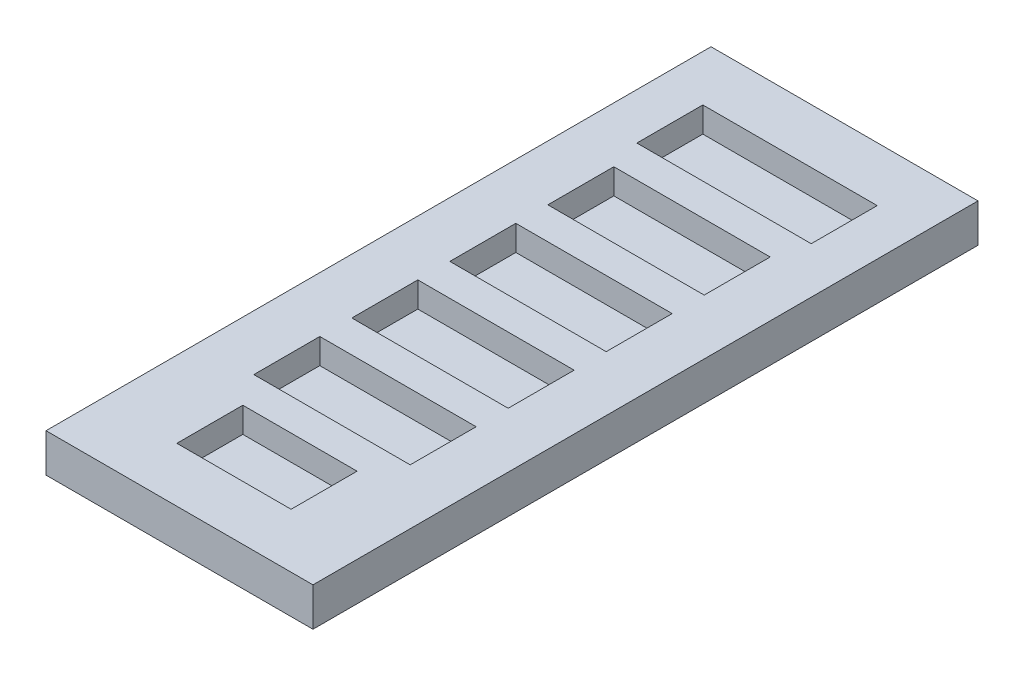
ISO-10303-21;
HEADER;
FILE_DESCRIPTION(('STEP AP214'),'2;1');
FILE_NAME('part.step','',(''),(''),'','','');
FILE_SCHEMA(('AUTOMOTIVE_DESIGN { 1 0 10303 214 1 1 1 1 }'));
ENDSEC;
DATA;
#1=APPLICATION_CONTEXT('core data for automotive mechanical design processes');
#2=APPLICATION_PROTOCOL_DEFINITION('international standard','automotive_design',2000,#1);
#3=PRODUCT_CONTEXT('',#1,'mechanical');
#4=PRODUCT('Part','Part','',(#3));
#5=PRODUCT_RELATED_PRODUCT_CATEGORY('part','',(#4));
#6=PRODUCT_DEFINITION_FORMATION('','',#4);
#7=PRODUCT_DEFINITION_CONTEXT('part definition',#1,'design');
#8=PRODUCT_DEFINITION('design','',#6,#7);
#9=PRODUCT_DEFINITION_SHAPE('','',#8);
#10=(LENGTH_UNIT() NAMED_UNIT(*) SI_UNIT(.MILLI.,.METRE.));
#11=(NAMED_UNIT(*) PLANE_ANGLE_UNIT() SI_UNIT($,.RADIAN.));
#12=(NAMED_UNIT(*) SI_UNIT($,.STERADIAN.) SOLID_ANGLE_UNIT());
#13=UNCERTAINTY_MEASURE_WITH_UNIT(LENGTH_MEASURE(1.E-05),#10,'distance_accuracy_value','');
#14=(GEOMETRIC_REPRESENTATION_CONTEXT(3) GLOBAL_UNCERTAINTY_ASSIGNED_CONTEXT((#13)) GLOBAL_UNIT_ASSIGNED_CONTEXT((#10,
#11,#12)) REPRESENTATION_CONTEXT('',''));
#15=CARTESIAN_POINT('',(0.,0.,0.));
#16=DIRECTION('',(0.,0.,1.));
#17=DIRECTION('',(1.,0.,0.));
#18=AXIS2_PLACEMENT_3D('',#15,#16,#17);
#19=CARTESIAN_POINT('',(444.,-64.,0.));
#20=DIRECTION('',(1.,0.,0.));
#21=DIRECTION('',(0.,0.,-1.));
#22=AXIS2_PLACEMENT_3D('',#19,#20,#21);
#23=PLANE('',#22);
#24=DIRECTION('',(0.,0.,-1.));
#25=VECTOR('',#24,1.);
#26=CARTESIAN_POINT('',(444.,0.,0.));
#27=LINE('',#26,#25);
#28=CARTESIAN_POINT('',(444.,0.,0.));
#29=VERTEX_POINT('',#28);
#30=CARTESIAN_POINT('',(444.,0.,-1106.));
#31=VERTEX_POINT('',#30);
#32=EDGE_CURVE('E255',#29,#31,#27,.T.);
#33=ORIENTED_EDGE('',*,*,#32,.F.);
#34=DIRECTION('',(0.,1.,0.));
#35=VECTOR('',#34,1.);
#36=CARTESIAN_POINT('',(444.,-64.,0.));
#37=LINE('',#36,#35);
#38=CARTESIAN_POINT('',(444.,-64.,0.));
#39=VERTEX_POINT('',#38);
#40=EDGE_CURVE('E11',#39,#29,#37,.T.);
#41=ORIENTED_EDGE('',*,*,#40,.F.);
#42=DIRECTION('',(0.,0.,-1.));
#43=VECTOR('',#42,1.);
#44=CARTESIAN_POINT('',(444.,-64.,0.));
#45=LINE('',#44,#43);
#46=CARTESIAN_POINT('',(444.,-64.,-1106.));
#47=VERTEX_POINT('',#46);
#48=EDGE_CURVE('E406',#39,#47,#45,.T.);
#49=ORIENTED_EDGE('',*,*,#48,.T.);
#50=DIRECTION('',(0.,1.,0.));
#51=VECTOR('',#50,1.);
#52=CARTESIAN_POINT('',(444.,-64.,-1106.));
#53=LINE('',#52,#51);
#54=EDGE_CURVE('E38',#47,#31,#53,.T.);
#55=ORIENTED_EDGE('',*,*,#54,.T.);
#56=EDGE_LOOP('',(#33,#41,#49,#55));
#57=FACE_BOUND('',#56,.T.);
#58=ADVANCED_FACE('F35',(#57),#23,.T.);
#59=CARTESIAN_POINT('',(0.,-64.,0.));
#60=DIRECTION('',(0.,0.,1.));
#61=DIRECTION('',(1.,0.,0.));
#62=AXIS2_PLACEMENT_3D('',#59,#60,#61);
#63=PLANE('',#62);
#64=DIRECTION('',(1.,0.,0.));
#65=VECTOR('',#64,1.);
#66=CARTESIAN_POINT('',(0.,0.,0.));
#67=LINE('',#66,#65);
#68=CARTESIAN_POINT('',(0.,0.,0.));
#69=VERTEX_POINT('',#68);
#70=EDGE_CURVE('E410',#69,#29,#67,.T.);
#71=ORIENTED_EDGE('',*,*,#70,.F.);
#72=DIRECTION('',(0.,1.,0.));
#73=VECTOR('',#72,1.);
#74=CARTESIAN_POINT('',(0.,-64.,0.));
#75=LINE('',#74,#73);
#76=CARTESIAN_POINT('',(0.,-64.,0.));
#77=VERTEX_POINT('',#76);
#78=EDGE_CURVE('E43',#77,#69,#75,.T.);
#79=ORIENTED_EDGE('',*,*,#78,.F.);
#80=DIRECTION('',(1.,0.,0.));
#81=VECTOR('',#80,1.);
#82=CARTESIAN_POINT('',(0.,-64.,0.));
#83=LINE('',#82,#81);
#84=EDGE_CURVE('E414',#77,#39,#83,.T.);
#85=ORIENTED_EDGE('',*,*,#84,.T.);
#86=ORIENTED_EDGE('',*,*,#40,.T.);
#87=EDGE_LOOP('',(#71,#79,#85,#86));
#88=FACE_BOUND('',#87,.T.);
#89=ADVANCED_FACE('F442',(#88),#63,.T.);
#90=CARTESIAN_POINT('',(0.,-64.,0.));
#91=DIRECTION('',(1.,0.,0.));
#92=DIRECTION('',(0.,0.,-1.));
#93=AXIS2_PLACEMENT_3D('',#90,#91,#92);
#94=PLANE('',#93);
#95=DIRECTION('',(0.,0.,-1.));
#96=VECTOR('',#95,1.);
#97=CARTESIAN_POINT('',(0.,0.,0.));
#98=LINE('',#97,#96);
#99=CARTESIAN_POINT('',(0.,0.,-1106.));
#100=VERTEX_POINT('',#99);
#101=EDGE_CURVE('E422',#69,#100,#98,.T.);
#102=ORIENTED_EDGE('',*,*,#101,.T.);
#103=DIRECTION('',(0.,1.,0.));
#104=VECTOR('',#103,1.);
#105=CARTESIAN_POINT('',(0.,-64.,-1106.));
#106=LINE('',#105,#104);
#107=CARTESIAN_POINT('',(0.,-64.,-1106.));
#108=VERTEX_POINT('',#107);
#109=EDGE_CURVE('E426',#108,#100,#106,.T.);
#110=ORIENTED_EDGE('',*,*,#109,.F.);
#111=DIRECTION('',(0.,0.,-1.));
#112=VECTOR('',#111,1.);
#113=CARTESIAN_POINT('',(0.,-64.,0.));
#114=LINE('',#113,#112);
#115=EDGE_CURVE('E412',#77,#108,#114,.T.);
#116=ORIENTED_EDGE('',*,*,#115,.F.);
#117=ORIENTED_EDGE('',*,*,#78,.T.);
#118=EDGE_LOOP('',(#102,#110,#116,#117));
#119=FACE_BOUND('',#118,.T.);
#120=ADVANCED_FACE('F448',(#119),#94,.F.);
#121=CARTESIAN_POINT('',(0.,-64.,-1106.));
#122=DIRECTION('',(0.,0.,1.));
#123=DIRECTION('',(1.,0.,0.));
#124=AXIS2_PLACEMENT_3D('',#121,#122,#123);
#125=PLANE('',#124);
#126=DIRECTION('',(1.,0.,0.));
#127=VECTOR('',#126,1.);
#128=CARTESIAN_POINT('',(0.,0.,-1106.));
#129=LINE('',#128,#127);
#130=EDGE_CURVE('E419',#100,#31,#129,.T.);
#131=ORIENTED_EDGE('',*,*,#130,.T.);
#132=ORIENTED_EDGE('',*,*,#54,.F.);
#133=DIRECTION('',(1.,0.,0.));
#134=VECTOR('',#133,1.);
#135=CARTESIAN_POINT('',(0.,-64.,-1106.));
#136=LINE('',#135,#134);
#137=EDGE_CURVE('E409',#108,#47,#136,.T.);
#138=ORIENTED_EDGE('',*,*,#137,.F.);
#139=ORIENTED_EDGE('',*,*,#109,.T.);
#140=EDGE_LOOP('',(#131,#132,#138,#139));
#141=FACE_BOUND('',#140,.T.);
#142=ADVANCED_FACE('F436',(#141),#125,.F.);
#143=CARTESIAN_POINT('',(0.,-64.,0.));
#144=DIRECTION('',(0.,-1.,0.));
#145=DIRECTION('',(0.,0.,-1.));
#146=AXIS2_PLACEMENT_3D('',#143,#144,#145);
#147=PLANE('',#146);
#148=ORIENTED_EDGE('',*,*,#48,.F.);
#149=ORIENTED_EDGE('',*,*,#84,.F.);
#150=ORIENTED_EDGE('',*,*,#115,.T.);
#151=ORIENTED_EDGE('',*,*,#137,.T.);
#152=EDGE_LOOP('',(#148,#149,#150,#151));
#153=FACE_BOUND('',#152,.T.);
#154=ADVANCED_FACE('F446',(#153),#147,.T.);
#155=CARTESIAN_POINT('',(0.,0.,0.));
#156=DIRECTION('',(0.,-1.,0.));
#157=DIRECTION('',(0.,0.,-1.));
#158=AXIS2_PLACEMENT_3D('',#155,#156,#157);
#159=PLANE('',#158);
#160=DIRECTION('',(0.,0.,-1.));
#161=VECTOR('',#160,1.);
#162=CARTESIAN_POINT('',(317.,0.,-200.363466897381));
#163=LINE('',#162,#161);
#164=CARTESIAN_POINT('',(317.,0.,-90.6365331026193));
#165=VERTEX_POINT('',#164);
#166=CARTESIAN_POINT('',(317.,0.,-200.363466897381));
#167=VERTEX_POINT('',#166);
#168=EDGE_CURVE('E245',#165,#167,#163,.T.);
#169=ORIENTED_EDGE('',*,*,#168,.F.);
#170=DIRECTION('',(1.,0.,0.));
#171=VECTOR('',#170,1.);
#172=CARTESIAN_POINT('',(127.,0.,-90.6365331026193));
#173=LINE('',#172,#171);
#174=CARTESIAN_POINT('',(127.,0.,-90.6365331026193));
#175=VERTEX_POINT('',#174);
#176=EDGE_CURVE('E224',#175,#165,#173,.T.);
#177=ORIENTED_EDGE('',*,*,#176,.F.);
#178=DIRECTION('',(0.,0.,1.));
#179=VECTOR('',#178,1.);
#180=CARTESIAN_POINT('',(127.,0.,-200.363466897381));
#181=LINE('',#180,#179);
#182=CARTESIAN_POINT('',(127.,0.,-200.363466897381));
#183=VERTEX_POINT('',#182);
#184=EDGE_CURVE('E240',#183,#175,#181,.T.);
#185=ORIENTED_EDGE('',*,*,#184,.F.);
#186=DIRECTION('',(-1.,0.,0.));
#187=VECTOR('',#186,1.);
#188=CARTESIAN_POINT('',(222.,0.,-200.363466897381));
#189=LINE('',#188,#187);
#190=EDGE_CURVE('E247',#167,#183,#189,.T.);
#191=ORIENTED_EDGE('',*,*,#190,.F.);
#192=EDGE_LOOP('',(#169,#177,#185,#191));
#193=FACE_BOUND('',#192,.T.);
#194=DIRECTION('',(-1.,0.,0.));
#195=VECTOR('',#194,1.);
#196=CARTESIAN_POINT('',(222.,0.,-1015.36346689738));
#197=LINE('',#196,#195);
#198=CARTESIAN_POINT('',(367.,0.,-1015.36346689738));
#199=VERTEX_POINT('',#198);
#200=CARTESIAN_POINT('',(76.9999999999998,0.,-1015.36346689738));
#201=VERTEX_POINT('',#200);
#202=EDGE_CURVE('E270',#199,#201,#197,.T.);
#203=ORIENTED_EDGE('',*,*,#202,.F.);
#204=DIRECTION('',(0.,0.,-1.));
#205=VECTOR('',#204,1.);
#206=CARTESIAN_POINT('',(367.,0.,-1015.36346689738));
#207=LINE('',#206,#205);
#208=CARTESIAN_POINT('',(367.,0.,-905.636533102621));
#209=VERTEX_POINT('',#208);
#210=EDGE_CURVE('E59',#209,#199,#207,.T.);
#211=ORIENTED_EDGE('',*,*,#210,.F.);
#212=DIRECTION('',(1.,0.,0.));
#213=VECTOR('',#212,1.);
#214=CARTESIAN_POINT('',(367.,0.,-905.636533102621));
#215=LINE('',#214,#213);
#216=CARTESIAN_POINT('',(76.9999999999998,0.,-905.63653310262));
#217=VERTEX_POINT('',#216);
#218=EDGE_CURVE('E277',#217,#209,#215,.T.);
#219=ORIENTED_EDGE('',*,*,#218,.F.);
#220=DIRECTION('',(0.,0.,1.));
#221=VECTOR('',#220,1.);
#222=CARTESIAN_POINT('',(76.9999999999998,0.,-1015.36346689738));
#223=LINE('',#222,#221);
#224=EDGE_CURVE('E273',#201,#217,#223,.T.);
#225=ORIENTED_EDGE('',*,*,#224,.F.);
#226=EDGE_LOOP('',(#203,#211,#219,#225));
#227=FACE_BOUND('',#226,.T.);
#228=DIRECTION('',(-1.,0.,0.));
#229=VECTOR('',#228,1.);
#230=CARTESIAN_POINT('',(222.,0.,-852.363466897382));
#231=LINE('',#230,#229);
#232=CARTESIAN_POINT('',(352.,0.,-852.363466897382));
#233=VERTEX_POINT('',#232);
#234=CARTESIAN_POINT('',(91.9999999999998,0.,-852.363466897382));
#235=VERTEX_POINT('',#234);
#236=EDGE_CURVE('E299',#233,#235,#231,.T.);
#237=ORIENTED_EDGE('',*,*,#236,.F.);
#238=DIRECTION('',(0.,0.,-1.));
#239=VECTOR('',#238,1.);
#240=CARTESIAN_POINT('',(352.,0.,-852.363466897382));
#241=LINE('',#240,#239);
#242=CARTESIAN_POINT('',(352.,0.,-742.63653310262));
#243=VERTEX_POINT('',#242);
#244=EDGE_CURVE('E290',#243,#233,#241,.T.);
#245=ORIENTED_EDGE('',*,*,#244,.F.);
#246=DIRECTION('',(1.,0.,0.));
#247=VECTOR('',#246,1.);
#248=CARTESIAN_POINT('',(352.,0.,-742.63653310262));
#249=LINE('',#248,#247);
#250=CARTESIAN_POINT('',(91.9999999999998,0.,-742.63653310262));
#251=VERTEX_POINT('',#250);
#252=EDGE_CURVE('E306',#251,#243,#249,.T.);
#253=ORIENTED_EDGE('',*,*,#252,.F.);
#254=DIRECTION('',(0.,0.,1.));
#255=VECTOR('',#254,1.);
#256=CARTESIAN_POINT('',(91.9999999999998,0.,-852.363466897382));
#257=LINE('',#256,#255);
#258=EDGE_CURVE('E302',#235,#251,#257,.T.);
#259=ORIENTED_EDGE('',*,*,#258,.F.);
#260=EDGE_LOOP('',(#237,#245,#253,#259));
#261=FACE_BOUND('',#260,.T.);
#262=DIRECTION('',(-1.,0.,0.));
#263=VECTOR('',#262,1.);
#264=CARTESIAN_POINT('',(222.,0.,-689.363466897382));
#265=LINE('',#264,#263);
#266=CARTESIAN_POINT('',(352.,0.,-689.363466897382));
#267=VERTEX_POINT('',#266);
#268=CARTESIAN_POINT('',(91.9999999999997,0.,-689.363466897382));
#269=VERTEX_POINT('',#268);
#270=EDGE_CURVE('E329',#267,#269,#265,.T.);
#271=ORIENTED_EDGE('',*,*,#270,.F.);
#272=DIRECTION('',(0.,0.,-1.));
#273=VECTOR('',#272,1.);
#274=CARTESIAN_POINT('',(352.,0.,-689.363466897382));
#275=LINE('',#274,#273);
#276=CARTESIAN_POINT('',(352.,0.,-579.63653310262));
#277=VERTEX_POINT('',#276);
#278=EDGE_CURVE('E320',#277,#267,#275,.T.);
#279=ORIENTED_EDGE('',*,*,#278,.F.);
#280=DIRECTION('',(1.,0.,0.));
#281=VECTOR('',#280,1.);
#282=CARTESIAN_POINT('',(352.,0.,-579.63653310262));
#283=LINE('',#282,#281);
#284=CARTESIAN_POINT('',(91.9999999999998,0.,-579.63653310262));
#285=VERTEX_POINT('',#284);
#286=EDGE_CURVE('E336',#285,#277,#283,.T.);
#287=ORIENTED_EDGE('',*,*,#286,.F.);
#288=DIRECTION('',(0.,0.,1.));
#289=VECTOR('',#288,1.);
#290=CARTESIAN_POINT('',(91.9999999999997,0.,-689.363466897382));
#291=LINE('',#290,#289);
#292=EDGE_CURVE('E332',#269,#285,#291,.T.);
#293=ORIENTED_EDGE('',*,*,#292,.F.);
#294=EDGE_LOOP('',(#271,#279,#287,#293));
#295=FACE_BOUND('',#294,.T.);
#296=DIRECTION('',(-1.,0.,0.));
#297=VECTOR('',#296,1.);
#298=CARTESIAN_POINT('',(222.,0.,-526.363466897381));
#299=LINE('',#298,#297);
#300=CARTESIAN_POINT('',(352.,0.,-526.363466897381));
#301=VERTEX_POINT('',#300);
#302=CARTESIAN_POINT('',(91.9999999999997,0.,-526.363466897381));
#303=VERTEX_POINT('',#302);
#304=EDGE_CURVE('E359',#301,#303,#299,.T.);
#305=ORIENTED_EDGE('',*,*,#304,.F.);
#306=DIRECTION('',(0.,0.,-1.));
#307=VECTOR('',#306,1.);
#308=CARTESIAN_POINT('',(352.,0.,-526.363466897381));
#309=LINE('',#308,#307);
#310=CARTESIAN_POINT('',(352.,0.,-416.63653310262));
#311=VERTEX_POINT('',#310);
#312=EDGE_CURVE('E350',#311,#301,#309,.T.);
#313=ORIENTED_EDGE('',*,*,#312,.F.);
#314=DIRECTION('',(1.,0.,0.));
#315=VECTOR('',#314,1.);
#316=CARTESIAN_POINT('',(352.,0.,-416.63653310262));
#317=LINE('',#316,#315);
#318=CARTESIAN_POINT('',(91.9999999999997,0.,-416.63653310262));
#319=VERTEX_POINT('',#318);
#320=EDGE_CURVE('E366',#319,#311,#317,.T.);
#321=ORIENTED_EDGE('',*,*,#320,.F.);
#322=DIRECTION('',(0.,0.,1.));
#323=VECTOR('',#322,1.);
#324=CARTESIAN_POINT('',(91.9999999999997,0.,-526.363466897381));
#325=LINE('',#324,#323);
#326=EDGE_CURVE('E362',#303,#319,#325,.T.);
#327=ORIENTED_EDGE('',*,*,#326,.F.);
#328=EDGE_LOOP('',(#305,#313,#321,#327));
#329=FACE_BOUND('',#328,.T.);
#330=DIRECTION('',(-1.,0.,0.));
#331=VECTOR('',#330,1.);
#332=CARTESIAN_POINT('',(222.,0.,-363.363466897381));
#333=LINE('',#332,#331);
#334=CARTESIAN_POINT('',(352.,0.,-363.363466897381));
#335=VERTEX_POINT('',#334);
#336=CARTESIAN_POINT('',(91.9999999999997,0.,-363.363466897381));
#337=VERTEX_POINT('',#336);
#338=EDGE_CURVE('E389',#335,#337,#333,.T.);
#339=ORIENTED_EDGE('',*,*,#338,.F.);
#340=DIRECTION('',(0.,0.,-1.));
#341=VECTOR('',#340,1.);
#342=CARTESIAN_POINT('',(352.,0.,-363.363466897381));
#343=LINE('',#342,#341);
#344=CARTESIAN_POINT('',(352.,0.,-253.636533102619));
#345=VERTEX_POINT('',#344);
#346=EDGE_CURVE('E380',#345,#335,#343,.T.);
#347=ORIENTED_EDGE('',*,*,#346,.F.);
#348=DIRECTION('',(1.,0.,0.));
#349=VECTOR('',#348,1.);
#350=CARTESIAN_POINT('',(352.,0.,-253.636533102619));
#351=LINE('',#350,#349);
#352=CARTESIAN_POINT('',(91.9999999999997,0.,-253.636533102619));
#353=VERTEX_POINT('',#352);
#354=EDGE_CURVE('E395',#353,#345,#351,.T.);
#355=ORIENTED_EDGE('',*,*,#354,.F.);
#356=DIRECTION('',(0.,0.,1.));
#357=VECTOR('',#356,1.);
#358=CARTESIAN_POINT('',(91.9999999999997,0.,-363.363466897381));
#359=LINE('',#358,#357);
#360=EDGE_CURVE('E392',#337,#353,#359,.T.);
#361=ORIENTED_EDGE('',*,*,#360,.F.);
#362=EDGE_LOOP('',(#339,#347,#355,#361));
#363=FACE_BOUND('',#362,.T.);
#364=ORIENTED_EDGE('',*,*,#32,.T.);
#365=ORIENTED_EDGE('',*,*,#130,.F.);
#366=ORIENTED_EDGE('',*,*,#101,.F.);
#367=ORIENTED_EDGE('',*,*,#70,.T.);
#368=EDGE_LOOP('',(#364,#365,#366,#367));
#369=FACE_BOUND('',#368,.T.);
#370=ADVANCED_FACE('F439',(#193,#227,#261,#295,#329,#363,#369),#159,.F.);
#371=CARTESIAN_POINT('',(352.,-42.,-363.363466897381));
#372=DIRECTION('',(1.,0.,0.));
#373=DIRECTION('',(0.,0.,-1.));
#374=AXIS2_PLACEMENT_3D('',#371,#372,#373);
#375=PLANE('',#374);
#376=ORIENTED_EDGE('',*,*,#346,.T.);
#377=DIRECTION('',(0.,1.,0.));
#378=VECTOR('',#377,1.);
#379=CARTESIAN_POINT('',(352.,-42.,-363.363466897381));
#380=LINE('',#379,#378);
#381=CARTESIAN_POINT('',(352.,-42.,-363.363466897381));
#382=VERTEX_POINT('',#381);
#383=EDGE_CURVE('E363',#382,#335,#380,.T.);
#384=ORIENTED_EDGE('',*,*,#383,.F.);
#385=DIRECTION('',(0.,0.,-1.));
#386=VECTOR('',#385,1.);
#387=CARTESIAN_POINT('',(352.,-42.,-363.363466897381));
#388=LINE('',#387,#386);
#389=CARTESIAN_POINT('',(352.,-42.,-253.636533102619));
#390=VERTEX_POINT('',#389);
#391=EDGE_CURVE('E385',#390,#382,#388,.T.);
#392=ORIENTED_EDGE('',*,*,#391,.F.);
#393=DIRECTION('',(0.,1.,0.));
#394=VECTOR('',#393,1.);
#395=CARTESIAN_POINT('',(352.,-42.,-253.636533102619));
#396=LINE('',#395,#394);
#397=EDGE_CURVE('E401',#390,#345,#396,.T.);
#398=ORIENTED_EDGE('',*,*,#397,.T.);
#399=EDGE_LOOP('',(#376,#384,#392,#398));
#400=FACE_BOUND('',#399,.T.);
#401=ADVANCED_FACE('F490',(#400),#375,.F.);
#402=CARTESIAN_POINT('',(352.,-42.,-253.636533102619));
#403=DIRECTION('',(0.,0.,1.));
#404=DIRECTION('',(1.,0.,0.));
#405=AXIS2_PLACEMENT_3D('',#402,#403,#404);
#406=PLANE('',#405);
#407=ORIENTED_EDGE('',*,*,#354,.T.);
#408=ORIENTED_EDGE('',*,*,#397,.F.);
#409=DIRECTION('',(1.,0.,0.));
#410=VECTOR('',#409,1.);
#411=CARTESIAN_POINT('',(91.9999999999997,-42.,-253.636533102619));
#412=LINE('',#411,#410);
#413=CARTESIAN_POINT('',(91.9999999999997,-42.,-253.636533102619));
#414=VERTEX_POINT('',#413);
#415=EDGE_CURVE('E383',#414,#390,#412,.T.);
#416=ORIENTED_EDGE('',*,*,#415,.F.);
#417=DIRECTION('',(0.,1.,0.));
#418=VECTOR('',#417,1.);
#419=CARTESIAN_POINT('',(91.9999999999997,-42.,-253.636533102619));
#420=LINE('',#419,#418);
#421=EDGE_CURVE('E403',#414,#353,#420,.T.);
#422=ORIENTED_EDGE('',*,*,#421,.T.);
#423=EDGE_LOOP('',(#407,#408,#416,#422));
#424=FACE_BOUND('',#423,.T.);
#425=ADVANCED_FACE('F500',(#424),#406,.F.);
#426=CARTESIAN_POINT('',(91.9999999999997,-42.,-363.363466897381));
#427=DIRECTION('',(-1.,0.,0.));
#428=DIRECTION('',(0.,0.,1.));
#429=AXIS2_PLACEMENT_3D('',#426,#427,#428);
#430=PLANE('',#429);
#431=ORIENTED_EDGE('',*,*,#360,.T.);
#432=ORIENTED_EDGE('',*,*,#421,.F.);
#433=DIRECTION('',(0.,0.,1.));
#434=VECTOR('',#433,1.);
#435=CARTESIAN_POINT('',(91.9999999999997,-42.,-363.363466897381));
#436=LINE('',#435,#434);
#437=CARTESIAN_POINT('',(91.9999999999997,-42.,-363.363466897381));
#438=VERTEX_POINT('',#437);
#439=EDGE_CURVE('E379',#438,#414,#436,.T.);
#440=ORIENTED_EDGE('',*,*,#439,.F.);
#441=DIRECTION('',(0.,1.,0.));
#442=VECTOR('',#441,1.);
#443=CARTESIAN_POINT('',(91.9999999999997,-42.,-363.363466897381));
#444=LINE('',#443,#442);
#445=EDGE_CURVE('E388',#438,#337,#444,.T.);
#446=ORIENTED_EDGE('',*,*,#445,.T.);
#447=EDGE_LOOP('',(#431,#432,#440,#446));
#448=FACE_BOUND('',#447,.T.);
#449=ADVANCED_FACE('F511',(#448),#430,.F.);
#450=CARTESIAN_POINT('',(222.,-42.,-363.363466897381));
#451=DIRECTION('',(0.,0.,-1.));
#452=DIRECTION('',(-1.,0.,0.));
#453=AXIS2_PLACEMENT_3D('',#450,#451,#452);
#454=PLANE('',#453);
#455=ORIENTED_EDGE('',*,*,#338,.T.);
#456=ORIENTED_EDGE('',*,*,#445,.F.);
#457=DIRECTION('',(-1.,0.,0.));
#458=VECTOR('',#457,1.);
#459=CARTESIAN_POINT('',(222.,-42.,-363.363466897381));
#460=LINE('',#459,#458);
#461=EDGE_CURVE('E377',#382,#438,#460,.T.);
#462=ORIENTED_EDGE('',*,*,#461,.F.);
#463=ORIENTED_EDGE('',*,*,#383,.T.);
#464=EDGE_LOOP('',(#455,#456,#462,#463));
#465=FACE_BOUND('',#464,.T.);
#466=ADVANCED_FACE('F521',(#465),#454,.F.);
#467=CARTESIAN_POINT('',(0.,-42.,0.));
#468=DIRECTION('',(0.,-1.,0.));
#469=DIRECTION('',(0.,0.,-1.));
#470=AXIS2_PLACEMENT_3D('',#467,#468,#469);
#471=PLANE('',#470);
#472=ORIENTED_EDGE('',*,*,#461,.T.);
#473=ORIENTED_EDGE('',*,*,#439,.T.);
#474=ORIENTED_EDGE('',*,*,#415,.T.);
#475=ORIENTED_EDGE('',*,*,#391,.T.);
#476=EDGE_LOOP('',(#472,#473,#474,#475));
#477=FACE_BOUND('',#476,.T.);
#478=ADVANCED_FACE('F532',(#477),#471,.F.);
#479=CARTESIAN_POINT('',(352.,-42.,-526.363466897381));
#480=DIRECTION('',(1.,0.,0.));
#481=DIRECTION('',(0.,0.,-1.));
#482=AXIS2_PLACEMENT_3D('',#479,#480,#481);
#483=PLANE('',#482);
#484=ORIENTED_EDGE('',*,*,#312,.T.);
#485=DIRECTION('',(0.,1.,0.));
#486=VECTOR('',#485,1.);
#487=CARTESIAN_POINT('',(352.,-42.,-526.363466897381));
#488=LINE('',#487,#486);
#489=CARTESIAN_POINT('',(352.,-42.,-526.363466897381));
#490=VERTEX_POINT('',#489);
#491=EDGE_CURVE('E333',#490,#301,#488,.T.);
#492=ORIENTED_EDGE('',*,*,#491,.F.);
#493=DIRECTION('',(0.,0.,-1.));
#494=VECTOR('',#493,1.);
#495=CARTESIAN_POINT('',(352.,-42.,-526.363466897381));
#496=LINE('',#495,#494);
#497=CARTESIAN_POINT('',(352.,-42.,-416.63653310262));
#498=VERTEX_POINT('',#497);
#499=EDGE_CURVE('E355',#498,#490,#496,.T.);
#500=ORIENTED_EDGE('',*,*,#499,.F.);
#501=DIRECTION('',(0.,1.,0.));
#502=VECTOR('',#501,1.);
#503=CARTESIAN_POINT('',(352.,-42.,-416.63653310262));
#504=LINE('',#503,#502);
#505=EDGE_CURVE('E372',#498,#311,#504,.T.);
#506=ORIENTED_EDGE('',*,*,#505,.T.);
#507=EDGE_LOOP('',(#484,#492,#500,#506));
#508=FACE_BOUND('',#507,.T.);
#509=ADVANCED_FACE('F542',(#508),#483,.F.);
#510=CARTESIAN_POINT('',(352.,-42.,-416.63653310262));
#511=DIRECTION('',(0.,0.,1.));
#512=DIRECTION('',(1.,0.,0.));
#513=AXIS2_PLACEMENT_3D('',#510,#511,#512);
#514=PLANE('',#513);
#515=ORIENTED_EDGE('',*,*,#320,.T.);
#516=ORIENTED_EDGE('',*,*,#505,.F.);
#517=DIRECTION('',(1.,0.,0.));
#518=VECTOR('',#517,1.);
#519=CARTESIAN_POINT('',(91.9999999999997,-42.,-416.63653310262));
#520=LINE('',#519,#518);
#521=CARTESIAN_POINT('',(91.9999999999997,-42.,-416.63653310262));
#522=VERTEX_POINT('',#521);
#523=EDGE_CURVE('E353',#522,#498,#520,.T.);
#524=ORIENTED_EDGE('',*,*,#523,.F.);
#525=DIRECTION('',(0.,1.,0.));
#526=VECTOR('',#525,1.);
#527=CARTESIAN_POINT('',(91.9999999999997,-42.,-416.63653310262));
#528=LINE('',#527,#526);
#529=EDGE_CURVE('E374',#522,#319,#528,.T.);
#530=ORIENTED_EDGE('',*,*,#529,.T.);
#531=EDGE_LOOP('',(#515,#516,#524,#530));
#532=FACE_BOUND('',#531,.T.);
#533=ADVANCED_FACE('F552',(#532),#514,.F.);
#534=CARTESIAN_POINT('',(91.9999999999997,-42.,-526.363466897381));
#535=DIRECTION('',(-1.,0.,0.));
#536=DIRECTION('',(0.,0.,1.));
#537=AXIS2_PLACEMENT_3D('',#534,#535,#536);
#538=PLANE('',#537);
#539=ORIENTED_EDGE('',*,*,#326,.T.);
#540=ORIENTED_EDGE('',*,*,#529,.F.);
#541=DIRECTION('',(0.,0.,1.));
#542=VECTOR('',#541,1.);
#543=CARTESIAN_POINT('',(91.9999999999997,-42.,-526.363466897381));
#544=LINE('',#543,#542);
#545=CARTESIAN_POINT('',(91.9999999999997,-42.,-526.363466897381));
#546=VERTEX_POINT('',#545);
#547=EDGE_CURVE('E349',#546,#522,#544,.T.);
#548=ORIENTED_EDGE('',*,*,#547,.F.);
#549=DIRECTION('',(0.,1.,0.));
#550=VECTOR('',#549,1.);
#551=CARTESIAN_POINT('',(91.9999999999997,-42.,-526.363466897381));
#552=LINE('',#551,#550);
#553=EDGE_CURVE('E358',#546,#303,#552,.T.);
#554=ORIENTED_EDGE('',*,*,#553,.T.);
#555=EDGE_LOOP('',(#539,#540,#548,#554));
#556=FACE_BOUND('',#555,.T.);
#557=ADVANCED_FACE('F563',(#556),#538,.F.);
#558=CARTESIAN_POINT('',(222.,-42.,-526.363466897381));
#559=DIRECTION('',(0.,0.,-1.));
#560=DIRECTION('',(-1.,0.,0.));
#561=AXIS2_PLACEMENT_3D('',#558,#559,#560);
#562=PLANE('',#561);
#563=ORIENTED_EDGE('',*,*,#304,.T.);
#564=ORIENTED_EDGE('',*,*,#553,.F.);
#565=DIRECTION('',(-1.,0.,0.));
#566=VECTOR('',#565,1.);
#567=CARTESIAN_POINT('',(222.,-42.,-526.363466897381));
#568=LINE('',#567,#566);
#569=EDGE_CURVE('E347',#490,#546,#568,.T.);
#570=ORIENTED_EDGE('',*,*,#569,.F.);
#571=ORIENTED_EDGE('',*,*,#491,.T.);
#572=EDGE_LOOP('',(#563,#564,#570,#571));
#573=FACE_BOUND('',#572,.T.);
#574=ADVANCED_FACE('F573',(#573),#562,.F.);
#575=CARTESIAN_POINT('',(0.,-42.,0.));
#576=DIRECTION('',(0.,-1.,0.));
#577=DIRECTION('',(0.,0.,-1.));
#578=AXIS2_PLACEMENT_3D('',#575,#576,#577);
#579=PLANE('',#578);
#580=ORIENTED_EDGE('',*,*,#569,.T.);
#581=ORIENTED_EDGE('',*,*,#547,.T.);
#582=ORIENTED_EDGE('',*,*,#523,.T.);
#583=ORIENTED_EDGE('',*,*,#499,.T.);
#584=EDGE_LOOP('',(#580,#581,#582,#583));
#585=FACE_BOUND('',#584,.T.);
#586=ADVANCED_FACE('F584',(#585),#579,.F.);
#587=CARTESIAN_POINT('',(352.,-42.,-689.363466897382));
#588=DIRECTION('',(1.,0.,0.));
#589=DIRECTION('',(0.,0.,-1.));
#590=AXIS2_PLACEMENT_3D('',#587,#588,#589);
#591=PLANE('',#590);
#592=ORIENTED_EDGE('',*,*,#278,.T.);
#593=DIRECTION('',(0.,1.,0.));
#594=VECTOR('',#593,1.);
#595=CARTESIAN_POINT('',(352.,-42.,-689.363466897382));
#596=LINE('',#595,#594);
#597=CARTESIAN_POINT('',(352.,-42.,-689.363466897382));
#598=VERTEX_POINT('',#597);
#599=EDGE_CURVE('E303',#598,#267,#596,.T.);
#600=ORIENTED_EDGE('',*,*,#599,.F.);
#601=DIRECTION('',(0.,0.,-1.));
#602=VECTOR('',#601,1.);
#603=CARTESIAN_POINT('',(352.,-42.,-689.363466897382));
#604=LINE('',#603,#602);
#605=CARTESIAN_POINT('',(352.,-42.,-579.63653310262));
#606=VERTEX_POINT('',#605);
#607=EDGE_CURVE('E325',#606,#598,#604,.T.);
#608=ORIENTED_EDGE('',*,*,#607,.F.);
#609=DIRECTION('',(0.,1.,0.));
#610=VECTOR('',#609,1.);
#611=CARTESIAN_POINT('',(352.,-42.,-579.63653310262));
#612=LINE('',#611,#610);
#613=EDGE_CURVE('E342',#606,#277,#612,.T.);
#614=ORIENTED_EDGE('',*,*,#613,.T.);
#615=EDGE_LOOP('',(#592,#600,#608,#614));
#616=FACE_BOUND('',#615,.T.);
#617=ADVANCED_FACE('F594',(#616),#591,.F.);
#618=CARTESIAN_POINT('',(352.,-42.,-579.63653310262));
#619=DIRECTION('',(0.,0.,1.));
#620=DIRECTION('',(1.,0.,0.));
#621=AXIS2_PLACEMENT_3D('',#618,#619,#620);
#622=PLANE('',#621);
#623=ORIENTED_EDGE('',*,*,#286,.T.);
#624=ORIENTED_EDGE('',*,*,#613,.F.);
#625=DIRECTION('',(1.,0.,0.));
#626=VECTOR('',#625,1.);
#627=CARTESIAN_POINT('',(91.9999999999998,-42.,-579.63653310262));
#628=LINE('',#627,#626);
#629=CARTESIAN_POINT('',(91.9999999999998,-42.,-579.63653310262));
#630=VERTEX_POINT('',#629);
#631=EDGE_CURVE('E323',#630,#606,#628,.T.);
#632=ORIENTED_EDGE('',*,*,#631,.F.);
#633=DIRECTION('',(0.,1.,0.));
#634=VECTOR('',#633,1.);
#635=CARTESIAN_POINT('',(91.9999999999998,-42.,-579.63653310262));
#636=LINE('',#635,#634);
#637=EDGE_CURVE('E344',#630,#285,#636,.T.);
#638=ORIENTED_EDGE('',*,*,#637,.T.);
#639=EDGE_LOOP('',(#623,#624,#632,#638));
#640=FACE_BOUND('',#639,.T.);
#641=ADVANCED_FACE('F604',(#640),#622,.F.);
#642=CARTESIAN_POINT('',(91.9999999999997,-42.,-689.363466897382));
#643=DIRECTION('',(-1.,0.,0.));
#644=DIRECTION('',(0.,0.,1.));
#645=AXIS2_PLACEMENT_3D('',#642,#643,#644);
#646=PLANE('',#645);
#647=ORIENTED_EDGE('',*,*,#292,.T.);
#648=ORIENTED_EDGE('',*,*,#637,.F.);
#649=DIRECTION('',(0.,0.,1.));
#650=VECTOR('',#649,1.);
#651=CARTESIAN_POINT('',(91.9999999999997,-42.,-689.363466897382));
#652=LINE('',#651,#650);
#653=CARTESIAN_POINT('',(91.9999999999997,-42.,-689.363466897382));
#654=VERTEX_POINT('',#653);
#655=EDGE_CURVE('E319',#654,#630,#652,.T.);
#656=ORIENTED_EDGE('',*,*,#655,.F.);
#657=DIRECTION('',(0.,1.,0.));
#658=VECTOR('',#657,1.);
#659=CARTESIAN_POINT('',(91.9999999999997,-42.,-689.363466897382));
#660=LINE('',#659,#658);
#661=EDGE_CURVE('E328',#654,#269,#660,.T.);
#662=ORIENTED_EDGE('',*,*,#661,.T.);
#663=EDGE_LOOP('',(#647,#648,#656,#662));
#664=FACE_BOUND('',#663,.T.);
#665=ADVANCED_FACE('F615',(#664),#646,.F.);
#666=CARTESIAN_POINT('',(222.,-42.,-689.363466897382));
#667=DIRECTION('',(0.,0.,-1.));
#668=DIRECTION('',(-1.,0.,0.));
#669=AXIS2_PLACEMENT_3D('',#666,#667,#668);
#670=PLANE('',#669);
#671=ORIENTED_EDGE('',*,*,#270,.T.);
#672=ORIENTED_EDGE('',*,*,#661,.F.);
#673=DIRECTION('',(-1.,0.,0.));
#674=VECTOR('',#673,1.);
#675=CARTESIAN_POINT('',(222.,-42.,-689.363466897382));
#676=LINE('',#675,#674);
#677=EDGE_CURVE('E317',#598,#654,#676,.T.);
#678=ORIENTED_EDGE('',*,*,#677,.F.);
#679=ORIENTED_EDGE('',*,*,#599,.T.);
#680=EDGE_LOOP('',(#671,#672,#678,#679));
#681=FACE_BOUND('',#680,.T.);
#682=ADVANCED_FACE('F625',(#681),#670,.F.);
#683=CARTESIAN_POINT('',(0.,-42.,0.));
#684=DIRECTION('',(0.,-1.,0.));
#685=DIRECTION('',(0.,0.,-1.));
#686=AXIS2_PLACEMENT_3D('',#683,#684,#685);
#687=PLANE('',#686);
#688=ORIENTED_EDGE('',*,*,#677,.T.);
#689=ORIENTED_EDGE('',*,*,#655,.T.);
#690=ORIENTED_EDGE('',*,*,#631,.T.);
#691=ORIENTED_EDGE('',*,*,#607,.T.);
#692=EDGE_LOOP('',(#688,#689,#690,#691));
#693=FACE_BOUND('',#692,.T.);
#694=ADVANCED_FACE('F636',(#693),#687,.F.);
#695=CARTESIAN_POINT('',(352.,-42.,-852.363466897382));
#696=DIRECTION('',(1.,0.,0.));
#697=DIRECTION('',(0.,0.,-1.));
#698=AXIS2_PLACEMENT_3D('',#695,#696,#697);
#699=PLANE('',#698);
#700=ORIENTED_EDGE('',*,*,#244,.T.);
#701=DIRECTION('',(0.,1.,0.));
#702=VECTOR('',#701,1.);
#703=CARTESIAN_POINT('',(352.,-42.,-852.363466897382));
#704=LINE('',#703,#702);
#705=CARTESIAN_POINT('',(352.,-42.,-852.363466897382));
#706=VERTEX_POINT('',#705);
#707=EDGE_CURVE('E274',#706,#233,#704,.T.);
#708=ORIENTED_EDGE('',*,*,#707,.F.);
#709=DIRECTION('',(0.,0.,-1.));
#710=VECTOR('',#709,1.);
#711=CARTESIAN_POINT('',(352.,-42.,-852.363466897382));
#712=LINE('',#711,#710);
#713=CARTESIAN_POINT('',(352.,-42.,-742.63653310262));
#714=VERTEX_POINT('',#713);
#715=EDGE_CURVE('E295',#714,#706,#712,.T.);
#716=ORIENTED_EDGE('',*,*,#715,.F.);
#717=DIRECTION('',(0.,1.,0.));
#718=VECTOR('',#717,1.);
#719=CARTESIAN_POINT('',(352.,-42.,-742.63653310262));
#720=LINE('',#719,#718);
#721=EDGE_CURVE('E312',#714,#243,#720,.T.);
#722=ORIENTED_EDGE('',*,*,#721,.T.);
#723=EDGE_LOOP('',(#700,#708,#716,#722));
#724=FACE_BOUND('',#723,.T.);
#725=ADVANCED_FACE('F646',(#724),#699,.F.);
#726=CARTESIAN_POINT('',(352.,-42.,-742.63653310262));
#727=DIRECTION('',(0.,0.,1.));
#728=DIRECTION('',(1.,0.,0.));
#729=AXIS2_PLACEMENT_3D('',#726,#727,#728);
#730=PLANE('',#729);
#731=ORIENTED_EDGE('',*,*,#252,.T.);
#732=ORIENTED_EDGE('',*,*,#721,.F.);
#733=DIRECTION('',(1.,0.,0.));
#734=VECTOR('',#733,1.);
#735=CARTESIAN_POINT('',(91.9999999999998,-42.,-742.63653310262));
#736=LINE('',#735,#734);
#737=CARTESIAN_POINT('',(91.9999999999998,-42.,-742.63653310262));
#738=VERTEX_POINT('',#737);
#739=EDGE_CURVE('E293',#738,#714,#736,.T.);
#740=ORIENTED_EDGE('',*,*,#739,.F.);
#741=DIRECTION('',(0.,1.,0.));
#742=VECTOR('',#741,1.);
#743=CARTESIAN_POINT('',(91.9999999999998,-42.,-742.63653310262));
#744=LINE('',#743,#742);
#745=EDGE_CURVE('E314',#738,#251,#744,.T.);
#746=ORIENTED_EDGE('',*,*,#745,.T.);
#747=EDGE_LOOP('',(#731,#732,#740,#746));
#748=FACE_BOUND('',#747,.T.);
#749=ADVANCED_FACE('F656',(#748),#730,.F.);
#750=CARTESIAN_POINT('',(91.9999999999998,-42.,-852.363466897382));
#751=DIRECTION('',(-1.,0.,0.));
#752=DIRECTION('',(0.,0.,1.));
#753=AXIS2_PLACEMENT_3D('',#750,#751,#752);
#754=PLANE('',#753);
#755=ORIENTED_EDGE('',*,*,#258,.T.);
#756=ORIENTED_EDGE('',*,*,#745,.F.);
#757=DIRECTION('',(0.,0.,1.));
#758=VECTOR('',#757,1.);
#759=CARTESIAN_POINT('',(91.9999999999998,-42.,-852.363466897382));
#760=LINE('',#759,#758);
#761=CARTESIAN_POINT('',(91.9999999999998,-42.,-852.363466897382));
#762=VERTEX_POINT('',#761);
#763=EDGE_CURVE('E289',#762,#738,#760,.T.);
#764=ORIENTED_EDGE('',*,*,#763,.F.);
#765=DIRECTION('',(0.,1.,0.));
#766=VECTOR('',#765,1.);
#767=CARTESIAN_POINT('',(91.9999999999998,-42.,-852.363466897382));
#768=LINE('',#767,#766);
#769=EDGE_CURVE('E298',#762,#235,#768,.T.);
#770=ORIENTED_EDGE('',*,*,#769,.T.);
#771=EDGE_LOOP('',(#755,#756,#764,#770));
#772=FACE_BOUND('',#771,.T.);
#773=ADVANCED_FACE('F667',(#772),#754,.F.);
#774=CARTESIAN_POINT('',(222.,-42.,-852.363466897382));
#775=DIRECTION('',(0.,0.,-1.));
#776=DIRECTION('',(-1.,0.,0.));
#777=AXIS2_PLACEMENT_3D('',#774,#775,#776);
#778=PLANE('',#777);
#779=ORIENTED_EDGE('',*,*,#236,.T.);
#780=ORIENTED_EDGE('',*,*,#769,.F.);
#781=DIRECTION('',(-1.,0.,0.));
#782=VECTOR('',#781,1.);
#783=CARTESIAN_POINT('',(222.,-42.,-852.363466897382));
#784=LINE('',#783,#782);
#785=EDGE_CURVE('E287',#706,#762,#784,.T.);
#786=ORIENTED_EDGE('',*,*,#785,.F.);
#787=ORIENTED_EDGE('',*,*,#707,.T.);
#788=EDGE_LOOP('',(#779,#780,#786,#787));
#789=FACE_BOUND('',#788,.T.);
#790=ADVANCED_FACE('F677',(#789),#778,.F.);
#791=CARTESIAN_POINT('',(0.,-42.,0.));
#792=DIRECTION('',(0.,-1.,0.));
#793=DIRECTION('',(0.,0.,-1.));
#794=AXIS2_PLACEMENT_3D('',#791,#792,#793);
#795=PLANE('',#794);
#796=ORIENTED_EDGE('',*,*,#785,.T.);
#797=ORIENTED_EDGE('',*,*,#763,.T.);
#798=ORIENTED_EDGE('',*,*,#739,.T.);
#799=ORIENTED_EDGE('',*,*,#715,.T.);
#800=EDGE_LOOP('',(#796,#797,#798,#799));
#801=FACE_BOUND('',#800,.T.);
#802=ADVANCED_FACE('F688',(#801),#795,.F.);
#803=CARTESIAN_POINT('',(367.,-42.,-1015.36346689738));
#804=DIRECTION('',(1.,0.,0.));
#805=DIRECTION('',(0.,0.,-1.));
#806=AXIS2_PLACEMENT_3D('',#803,#804,#805);
#807=PLANE('',#806);
#808=ORIENTED_EDGE('',*,*,#210,.T.);
#809=DIRECTION('',(0.,1.,0.));
#810=VECTOR('',#809,1.);
#811=CARTESIAN_POINT('',(367.,-42.,-1015.36346689738));
#812=LINE('',#811,#810);
#813=CARTESIAN_POINT('',(367.,-42.,-1015.36346689738));
#814=VERTEX_POINT('',#813);
#815=EDGE_CURVE('E248',#814,#199,#812,.T.);
#816=ORIENTED_EDGE('',*,*,#815,.F.);
#817=DIRECTION('',(0.,0.,-1.));
#818=VECTOR('',#817,1.);
#819=CARTESIAN_POINT('',(367.,-42.,-1015.36346689738));
#820=LINE('',#819,#818);
#821=CARTESIAN_POINT('',(367.,-42.,-905.636533102621));
#822=VERTEX_POINT('',#821);
#823=EDGE_CURVE('E266',#822,#814,#820,.T.);
#824=ORIENTED_EDGE('',*,*,#823,.F.);
#825=DIRECTION('',(0.,1.,0.));
#826=VECTOR('',#825,1.);
#827=CARTESIAN_POINT('',(367.,-42.,-905.636533102621));
#828=LINE('',#827,#826);
#829=EDGE_CURVE('E282',#822,#209,#828,.T.);
#830=ORIENTED_EDGE('',*,*,#829,.T.);
#831=EDGE_LOOP('',(#808,#816,#824,#830));
#832=FACE_BOUND('',#831,.T.);
#833=ADVANCED_FACE('F698',(#832),#807,.F.);
#834=CARTESIAN_POINT('',(367.,-42.,-905.636533102621));
#835=DIRECTION('',(0.,0.,1.));
#836=DIRECTION('',(1.,0.,0.));
#837=AXIS2_PLACEMENT_3D('',#834,#835,#836);
#838=PLANE('',#837);
#839=ORIENTED_EDGE('',*,*,#218,.T.);
#840=ORIENTED_EDGE('',*,*,#829,.F.);
#841=DIRECTION('',(1.,0.,0.));
#842=VECTOR('',#841,1.);
#843=CARTESIAN_POINT('',(76.9999999999998,-42.,-905.63653310262));
#844=LINE('',#843,#842);
#845=CARTESIAN_POINT('',(76.9999999999998,-42.,-905.63653310262));
#846=VERTEX_POINT('',#845);
#847=EDGE_CURVE('E264',#846,#822,#844,.T.);
#848=ORIENTED_EDGE('',*,*,#847,.F.);
#849=DIRECTION('',(0.,1.,0.));
#850=VECTOR('',#849,1.);
#851=CARTESIAN_POINT('',(76.9999999999998,-42.,-905.63653310262));
#852=LINE('',#851,#850);
#853=EDGE_CURVE('E284',#846,#217,#852,.T.);
#854=ORIENTED_EDGE('',*,*,#853,.T.);
#855=EDGE_LOOP('',(#839,#840,#848,#854));
#856=FACE_BOUND('',#855,.T.);
#857=ADVANCED_FACE('F708',(#856),#838,.F.);
#858=CARTESIAN_POINT('',(76.9999999999998,-42.,-1015.36346689738));
#859=DIRECTION('',(-1.,0.,0.));
#860=DIRECTION('',(0.,0.,1.));
#861=AXIS2_PLACEMENT_3D('',#858,#859,#860);
#862=PLANE('',#861);
#863=ORIENTED_EDGE('',*,*,#224,.T.);
#864=ORIENTED_EDGE('',*,*,#853,.F.);
#865=DIRECTION('',(0.,0.,1.));
#866=VECTOR('',#865,1.);
#867=CARTESIAN_POINT('',(76.9999999999998,-42.,-1015.36346689738));
#868=LINE('',#867,#866);
#869=CARTESIAN_POINT('',(76.9999999999998,-42.,-1015.36346689738));
#870=VERTEX_POINT('',#869);
#871=EDGE_CURVE('E261',#870,#846,#868,.T.);
#872=ORIENTED_EDGE('',*,*,#871,.F.);
#873=DIRECTION('',(0.,1.,0.));
#874=VECTOR('',#873,1.);
#875=CARTESIAN_POINT('',(76.9999999999998,-42.,-1015.36346689738));
#876=LINE('',#875,#874);
#877=EDGE_CURVE('E269',#870,#201,#876,.T.);
#878=ORIENTED_EDGE('',*,*,#877,.T.);
#879=EDGE_LOOP('',(#863,#864,#872,#878));
#880=FACE_BOUND('',#879,.T.);
#881=ADVANCED_FACE('F718',(#880),#862,.F.);
#882=CARTESIAN_POINT('',(222.,-42.,-1015.36346689738));
#883=DIRECTION('',(0.,0.,-1.));
#884=DIRECTION('',(-1.,0.,0.));
#885=AXIS2_PLACEMENT_3D('',#882,#883,#884);
#886=PLANE('',#885);
#887=ORIENTED_EDGE('',*,*,#202,.T.);
#888=ORIENTED_EDGE('',*,*,#877,.F.);
#889=DIRECTION('',(-1.,0.,0.));
#890=VECTOR('',#889,1.);
#891=CARTESIAN_POINT('',(222.,-42.,-1015.36346689738));
#892=LINE('',#891,#890);
#893=EDGE_CURVE('E259',#814,#870,#892,.T.);
#894=ORIENTED_EDGE('',*,*,#893,.F.);
#895=ORIENTED_EDGE('',*,*,#815,.T.);
#896=EDGE_LOOP('',(#887,#888,#894,#895));
#897=FACE_BOUND('',#896,.T.);
#898=ADVANCED_FACE('F728',(#897),#886,.F.);
#899=CARTESIAN_POINT('',(0.,-42.,0.));
#900=DIRECTION('',(0.,-1.,0.));
#901=DIRECTION('',(0.,0.,-1.));
#902=AXIS2_PLACEMENT_3D('',#899,#900,#901);
#903=PLANE('',#902);
#904=ORIENTED_EDGE('',*,*,#893,.T.);
#905=ORIENTED_EDGE('',*,*,#871,.T.);
#906=ORIENTED_EDGE('',*,*,#847,.T.);
#907=ORIENTED_EDGE('',*,*,#823,.T.);
#908=EDGE_LOOP('',(#904,#905,#906,#907));
#909=FACE_BOUND('',#908,.T.);
#910=ADVANCED_FACE('F739',(#909),#903,.F.);
#911=CARTESIAN_POINT('',(127.,-42.,-90.6365331026193));
#912=DIRECTION('',(0.,0.,1.));
#913=DIRECTION('',(1.,0.,0.));
#914=AXIS2_PLACEMENT_3D('',#911,#912,#913);
#915=PLANE('',#914);
#916=ORIENTED_EDGE('',*,*,#176,.T.);
#917=DIRECTION('',(0.,1.,0.));
#918=VECTOR('',#917,1.);
#919=CARTESIAN_POINT('',(317.,-42.,-90.6365331026193));
#920=LINE('',#919,#918);
#921=CARTESIAN_POINT('',(317.,-42.,-90.6365331026193));
#922=VERTEX_POINT('',#921);
#923=EDGE_CURVE('E51',#922,#165,#920,.T.);
#924=ORIENTED_EDGE('',*,*,#923,.F.);
#925=DIRECTION('',(1.,0.,0.));
#926=VECTOR('',#925,1.);
#927=CARTESIAN_POINT('',(317.,-42.,-90.6365331026193));
#928=LINE('',#927,#926);
#929=CARTESIAN_POINT('',(127.,-42.,-90.6365331026193));
#930=VERTEX_POINT('',#929);
#931=EDGE_CURVE('E221',#930,#922,#928,.T.);
#932=ORIENTED_EDGE('',*,*,#931,.F.);
#933=DIRECTION('',(0.,1.,0.));
#934=VECTOR('',#933,1.);
#935=CARTESIAN_POINT('',(127.,-42.,-90.6365331026193));
#936=LINE('',#935,#934);
#937=EDGE_CURVE('E253',#930,#175,#936,.T.);
#938=ORIENTED_EDGE('',*,*,#937,.T.);
#939=EDGE_LOOP('',(#916,#924,#932,#938));
#940=FACE_BOUND('',#939,.T.);
#941=ADVANCED_FACE('F219',(#940),#915,.F.);
#942=CARTESIAN_POINT('',(127.,-42.,-200.363466897381));
#943=DIRECTION('',(-1.,0.,0.));
#944=DIRECTION('',(0.,0.,1.));
#945=AXIS2_PLACEMENT_3D('',#942,#943,#944);
#946=PLANE('',#945);
#947=ORIENTED_EDGE('',*,*,#184,.T.);
#948=ORIENTED_EDGE('',*,*,#937,.F.);
#949=DIRECTION('',(0.,0.,1.));
#950=VECTOR('',#949,1.);
#951=CARTESIAN_POINT('',(127.,-42.,-200.363466897381));
#952=LINE('',#951,#950);
#953=CARTESIAN_POINT('',(127.,-42.,-200.363466897381));
#954=VERTEX_POINT('',#953);
#955=EDGE_CURVE('E227',#954,#930,#952,.T.);
#956=ORIENTED_EDGE('',*,*,#955,.F.);
#957=DIRECTION('',(0.,1.,0.));
#958=VECTOR('',#957,1.);
#959=CARTESIAN_POINT('',(127.,-42.,-200.363466897381));
#960=LINE('',#959,#958);
#961=EDGE_CURVE('E256',#954,#183,#960,.T.);
#962=ORIENTED_EDGE('',*,*,#961,.T.);
#963=EDGE_LOOP('',(#947,#948,#956,#962));
#964=FACE_BOUND('',#963,.T.);
#965=ADVANCED_FACE('F759',(#964),#946,.F.);
#966=CARTESIAN_POINT('',(222.,-42.,-200.363466897381));
#967=DIRECTION('',(0.,0.,-1.));
#968=DIRECTION('',(-1.,0.,0.));
#969=AXIS2_PLACEMENT_3D('',#966,#967,#968);
#970=PLANE('',#969);
#971=ORIENTED_EDGE('',*,*,#190,.T.);
#972=ORIENTED_EDGE('',*,*,#961,.F.);
#973=DIRECTION('',(-1.,0.,0.));
#974=VECTOR('',#973,1.);
#975=CARTESIAN_POINT('',(222.,-42.,-200.363466897381));
#976=LINE('',#975,#974);
#977=CARTESIAN_POINT('',(317.,-42.,-200.363466897381));
#978=VERTEX_POINT('',#977);
#979=EDGE_CURVE('E234',#978,#954,#976,.T.);
#980=ORIENTED_EDGE('',*,*,#979,.F.);
#981=DIRECTION('',(0.,1.,0.));
#982=VECTOR('',#981,1.);
#983=CARTESIAN_POINT('',(317.,-42.,-200.363466897381));
#984=LINE('',#983,#982);
#985=EDGE_CURVE('E226',#978,#167,#984,.T.);
#986=ORIENTED_EDGE('',*,*,#985,.T.);
#987=EDGE_LOOP('',(#971,#972,#980,#986));
#988=FACE_BOUND('',#987,.T.);
#989=ADVANCED_FACE('F768',(#988),#970,.F.);
#990=CARTESIAN_POINT('',(317.,-42.,-200.363466897381));
#991=DIRECTION('',(1.,0.,0.));
#992=DIRECTION('',(0.,0.,-1.));
#993=AXIS2_PLACEMENT_3D('',#990,#991,#992);
#994=PLANE('',#993);
#995=ORIENTED_EDGE('',*,*,#168,.T.);
#996=ORIENTED_EDGE('',*,*,#985,.F.);
#997=DIRECTION('',(0.,0.,-1.));
#998=VECTOR('',#997,1.);
#999=CARTESIAN_POINT('',(317.,-42.,-200.363466897381));
#1000=LINE('',#999,#998);
#1001=EDGE_CURVE('E230',#922,#978,#1000,.T.);
#1002=ORIENTED_EDGE('',*,*,#1001,.F.);
#1003=ORIENTED_EDGE('',*,*,#923,.T.);
#1004=EDGE_LOOP('',(#995,#996,#1002,#1003));
#1005=FACE_BOUND('',#1004,.T.);
#1006=ADVANCED_FACE('F231',(#1005),#994,.F.);
#1007=CARTESIAN_POINT('',(0.,-42.,0.));
#1008=DIRECTION('',(0.,1.,0.));
#1009=DIRECTION('',(0.,0.,1.));
#1010=AXIS2_PLACEMENT_3D('',#1007,#1008,#1009);
#1011=PLANE('',#1010);
#1012=ORIENTED_EDGE('',*,*,#931,.T.);
#1013=ORIENTED_EDGE('',*,*,#1001,.T.);
#1014=ORIENTED_EDGE('',*,*,#979,.T.);
#1015=ORIENTED_EDGE('',*,*,#955,.T.);
#1016=EDGE_LOOP('',(#1012,#1013,#1014,#1015));
#1017=FACE_BOUND('',#1016,.T.);
#1018=ADVANCED_FACE('F237',(#1017),#1011,.T.);
#1019=CLOSED_SHELL('',(#58,#89,#120,#142,#154,#370,#401,#425,#449,#466,#478,#509,#533,#557,#574,
#586,#617,#641,#665,#682,#694,#725,#749,#773,#790,#802,#833,#857,#881,#898,#910,#941,#965,#989,
#1006,#1018));
#1020=MANIFOLD_SOLID_BREP('B2',#1019);
#1021=ADVANCED_BREP_SHAPE_REPRESENTATION('',(#18,#1020),#14);
#1022=SHAPE_DEFINITION_REPRESENTATION(#9,#1021);
ENDSEC;
END-ISO-10303-21;
